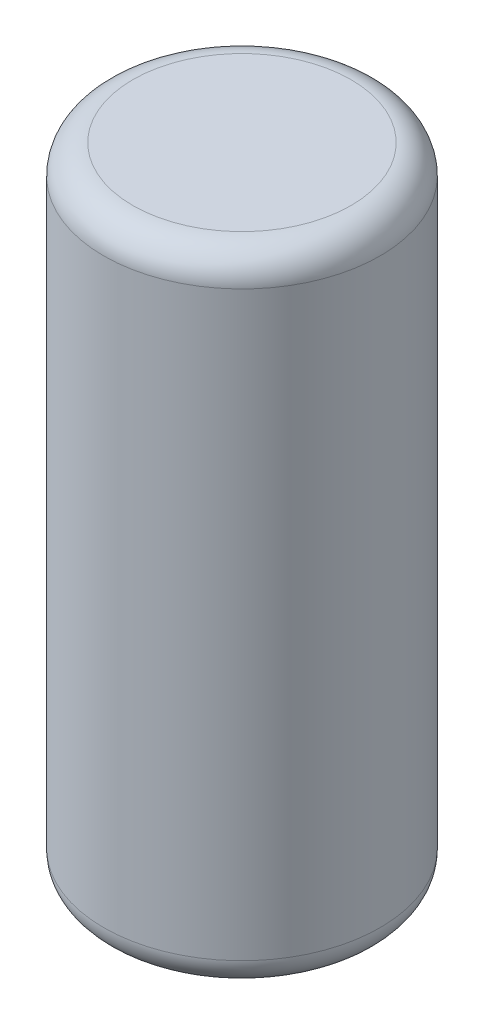
ISO-10303-21;
HEADER;
FILE_DESCRIPTION(('STEP AP214'),'2;1');
FILE_NAME('part.step','',(''),(''),'','','');
FILE_SCHEMA(('AUTOMOTIVE_DESIGN { 1 0 10303 214 1 1 1 1 }'));
ENDSEC;
DATA;
#1=APPLICATION_CONTEXT('core data for automotive mechanical design processes');
#2=APPLICATION_PROTOCOL_DEFINITION('international standard','automotive_design',2000,#1);
#3=PRODUCT_CONTEXT('',#1,'mechanical');
#4=PRODUCT('Part','Part','',(#3));
#5=PRODUCT_RELATED_PRODUCT_CATEGORY('part','',(#4));
#6=PRODUCT_DEFINITION_FORMATION('','',#4);
#7=PRODUCT_DEFINITION_CONTEXT('part definition',#1,'design');
#8=PRODUCT_DEFINITION('design','',#6,#7);
#9=PRODUCT_DEFINITION_SHAPE('','',#8);
#10=(LENGTH_UNIT() NAMED_UNIT(*) SI_UNIT(.MILLI.,.METRE.));
#11=(NAMED_UNIT(*) PLANE_ANGLE_UNIT() SI_UNIT($,.RADIAN.));
#12=(NAMED_UNIT(*) SI_UNIT($,.STERADIAN.) SOLID_ANGLE_UNIT());
#13=UNCERTAINTY_MEASURE_WITH_UNIT(LENGTH_MEASURE(1.E-05),#10,'distance_accuracy_value','');
#14=(GEOMETRIC_REPRESENTATION_CONTEXT(3) GLOBAL_UNCERTAINTY_ASSIGNED_CONTEXT((#13)) GLOBAL_UNIT_ASSIGNED_CONTEXT((#10,
#11,#12)) REPRESENTATION_CONTEXT('',''));
#15=CARTESIAN_POINT('',(0.,0.,0.));
#16=DIRECTION('',(0.,0.,1.));
#17=DIRECTION('',(1.,0.,0.));
#18=AXIS2_PLACEMENT_3D('',#15,#16,#17);
#19=CARTESIAN_POINT('',(0.,22.,0.));
#20=DIRECTION('',(0.,-1.,0.));
#21=DIRECTION('',(0.,0.,-1.));
#22=AXIS2_PLACEMENT_3D('',#19,#20,#21);
#23=CYLINDRICAL_SURFACE('',#22,4.75);
#24=CARTESIAN_POINT('',(0.,1.,0.));
#25=DIRECTION('',(0.,1.,0.));
#26=DIRECTION('',(0.,0.,1.));
#27=AXIS2_PLACEMENT_3D('',#24,#25,#26);
#28=CIRCLE('',#27,4.75);
#29=CARTESIAN_POINT('',(0.,1.,4.75));
#30=VERTEX_POINT('',#29);
#31=EDGE_CURVE('E50',#30,#30,#28,.T.);
#32=ORIENTED_EDGE('',*,*,#31,.T.);
#33=EDGE_LOOP('',(#32));
#34=FACE_BOUND('',#33,.T.);
#35=CARTESIAN_POINT('',(0.,21.,0.));
#36=DIRECTION('',(0.,1.,0.));
#37=DIRECTION('',(0.,0.,1.));
#38=AXIS2_PLACEMENT_3D('',#35,#36,#37);
#39=CIRCLE('',#38,4.75);
#40=CARTESIAN_POINT('',(0.,21.,4.75));
#41=VERTEX_POINT('',#40);
#42=EDGE_CURVE('E54',#41,#41,#39,.F.);
#43=ORIENTED_EDGE('',*,*,#42,.T.);
#44=EDGE_LOOP('',(#43));
#45=FACE_BOUND('',#44,.T.);
#46=ADVANCED_FACE('F39',(#34,#45),#23,.T.);
#47=CARTESIAN_POINT('',(0.,22.,0.));
#48=DIRECTION('',(0.,1.,0.));
#49=DIRECTION('',(0.,0.,1.));
#50=AXIS2_PLACEMENT_3D('',#47,#48,#49);
#51=PLANE('',#50);
#52=CARTESIAN_POINT('',(0.,22.,0.));
#53=DIRECTION('',(0.,1.,0.));
#54=DIRECTION('',(0.,0.,1.));
#55=AXIS2_PLACEMENT_3D('',#52,#53,#54);
#56=CIRCLE('',#55,3.75);
#57=CARTESIAN_POINT('',(0.,22.,3.75));
#58=VERTEX_POINT('',#57);
#59=EDGE_CURVE('E10',#58,#58,#56,.T.);
#60=ORIENTED_EDGE('',*,*,#59,.T.);
#61=EDGE_LOOP('',(#60));
#62=FACE_BOUND('',#61,.T.);
#63=ADVANCED_FACE('F70',(#62),#51,.T.);
#64=CARTESIAN_POINT('',(0.,0.,0.));
#65=DIRECTION('',(0.,1.,0.));
#66=DIRECTION('',(0.,0.,1.));
#67=AXIS2_PLACEMENT_3D('',#64,#65,#66);
#68=PLANE('',#67);
#69=CARTESIAN_POINT('',(0.,0.,0.));
#70=DIRECTION('',(0.,1.,0.));
#71=DIRECTION('',(0.,0.,1.));
#72=AXIS2_PLACEMENT_3D('',#69,#70,#71);
#73=CIRCLE('',#72,3.75);
#74=CARTESIAN_POINT('',(0.,0.,3.75));
#75=VERTEX_POINT('',#74);
#76=EDGE_CURVE('E46',#75,#75,#73,.F.);
#77=ORIENTED_EDGE('',*,*,#76,.T.);
#78=EDGE_LOOP('',(#77));
#79=FACE_BOUND('',#78,.T.);
#80=ADVANCED_FACE('F67',(#79),#68,.F.);
#81=CARTESIAN_POINT('',(0.,1.,0.));
#82=DIRECTION('',(0.,1.,0.));
#83=DIRECTION('',(0.,0.,1.));
#84=AXIS2_PLACEMENT_3D('',#81,#82,#83);
#85=TOROIDAL_SURFACE('',#84,3.75,1.);
#86=ORIENTED_EDGE('',*,*,#76,.F.);
#87=EDGE_LOOP('',(#86));
#88=FACE_BOUND('',#87,.T.);
#89=ORIENTED_EDGE('',*,*,#31,.F.);
#90=EDGE_LOOP('',(#89));
#91=FACE_BOUND('',#90,.T.);
#92=ADVANCED_FACE('F63',(#88,#91),#85,.T.);
#93=CARTESIAN_POINT('',(0.,21.,0.));
#94=DIRECTION('',(0.,1.,0.));
#95=DIRECTION('',(0.,0.,1.));
#96=AXIS2_PLACEMENT_3D('',#93,#94,#95);
#97=TOROIDAL_SURFACE('',#96,3.75,1.);
#98=ORIENTED_EDGE('',*,*,#42,.F.);
#99=EDGE_LOOP('',(#98));
#100=FACE_BOUND('',#99,.T.);
#101=ORIENTED_EDGE('',*,*,#59,.F.);
#102=EDGE_LOOP('',(#101));
#103=FACE_BOUND('',#102,.T.);
#104=ADVANCED_FACE('F41',(#100,#103),#97,.T.);
#105=CLOSED_SHELL('',(#46,#63,#80,#92,#104));
#106=MANIFOLD_SOLID_BREP('B2',#105);
#107=ADVANCED_BREP_SHAPE_REPRESENTATION('',(#18,#106),#14);
#108=SHAPE_DEFINITION_REPRESENTATION(#9,#107);
ENDSEC;
END-ISO-10303-21;
